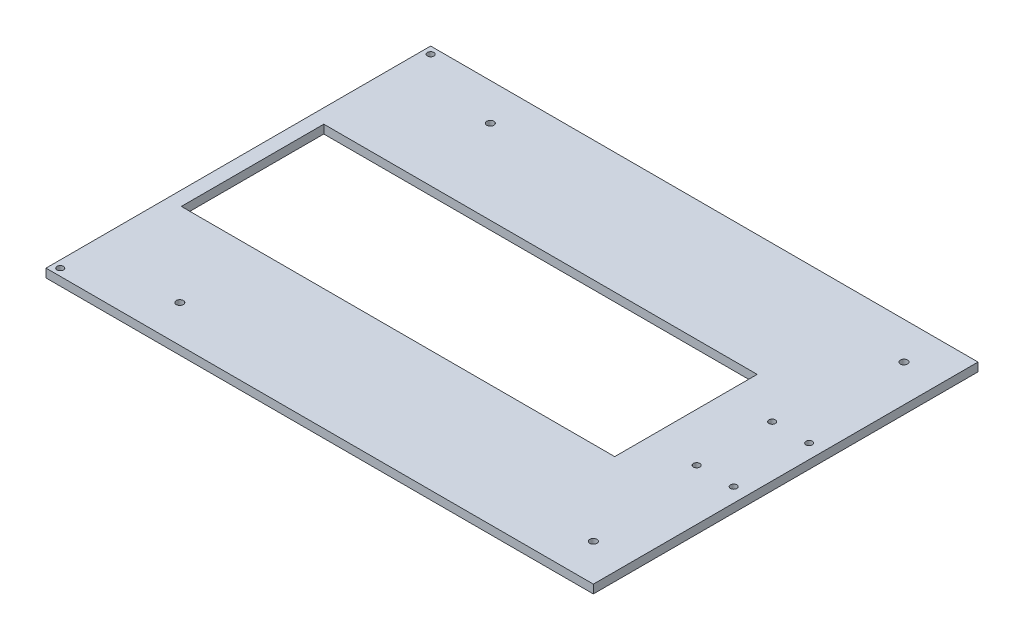
ISO-10303-21;
HEADER;
FILE_DESCRIPTION(('STEP AP214'),'2;1');
FILE_NAME('part.step','',(''),(''),'','','');
FILE_SCHEMA(('AUTOMOTIVE_DESIGN { 1 0 10303 214 1 1 1 1 }'));
ENDSEC;
DATA;
#1=APPLICATION_CONTEXT('core data for automotive mechanical design processes');
#2=APPLICATION_PROTOCOL_DEFINITION('international standard','automotive_design',2000,#1);
#3=PRODUCT_CONTEXT('',#1,'mechanical');
#4=PRODUCT('Part','Part','',(#3));
#5=PRODUCT_RELATED_PRODUCT_CATEGORY('part','',(#4));
#6=PRODUCT_DEFINITION_FORMATION('','',#4);
#7=PRODUCT_DEFINITION_CONTEXT('part definition',#1,'design');
#8=PRODUCT_DEFINITION('design','',#6,#7);
#9=PRODUCT_DEFINITION_SHAPE('','',#8);
#10=(LENGTH_UNIT() NAMED_UNIT(*) SI_UNIT(.MILLI.,.METRE.));
#11=(NAMED_UNIT(*) PLANE_ANGLE_UNIT() SI_UNIT($,.RADIAN.));
#12=(NAMED_UNIT(*) SI_UNIT($,.STERADIAN.) SOLID_ANGLE_UNIT());
#13=UNCERTAINTY_MEASURE_WITH_UNIT(LENGTH_MEASURE(1.E-05),#10,'distance_accuracy_value','');
#14=(GEOMETRIC_REPRESENTATION_CONTEXT(3) GLOBAL_UNCERTAINTY_ASSIGNED_CONTEXT((#13)) GLOBAL_UNIT_ASSIGNED_CONTEXT((#10,
#11,#12)) REPRESENTATION_CONTEXT('',''));
#15=CARTESIAN_POINT('',(0.,0.,0.));
#16=DIRECTION('',(0.,0.,1.));
#17=DIRECTION('',(1.,0.,0.));
#18=AXIS2_PLACEMENT_3D('',#15,#16,#17);
#19=CARTESIAN_POINT('',(-334.2,-12.,262.921508101416));
#20=DIRECTION('',(0.,0.,1.));
#21=DIRECTION('',(1.,0.,0.));
#22=AXIS2_PLACEMENT_3D('',#19,#20,#21);
#23=PLANE('',#22);
#24=DIRECTION('',(0.,-1.,0.));
#25=VECTOR('',#24,1.);
#26=CARTESIAN_POINT('',(-20.0000000000002,-12.,262.921508101416));
#27=LINE('',#26,#25);
#28=CARTESIAN_POINT('',(-20.0000000000002,-6.,262.921508101416));
#29=VERTEX_POINT('',#28);
#30=CARTESIAN_POINT('',(-20.0000000000002,-12.,262.921508101416));
#31=VERTEX_POINT('',#30);
#32=EDGE_CURVE('E60',#29,#31,#27,.T.);
#33=ORIENTED_EDGE('',*,*,#32,.T.);
#34=DIRECTION('',(1.,0.,0.));
#35=VECTOR('',#34,1.);
#36=CARTESIAN_POINT('',(-334.2,-12.,262.921508101416));
#37=LINE('',#36,#35);
#38=CARTESIAN_POINT('',(-324.2,-12.,262.921508101416));
#39=VERTEX_POINT('',#38);
#40=EDGE_CURVE('E214',#39,#31,#37,.T.);
#41=ORIENTED_EDGE('',*,*,#40,.F.);
#42=DIRECTION('',(0.,1.,0.));
#43=VECTOR('',#42,1.);
#44=CARTESIAN_POINT('',(-324.2,-12.,262.921508101416));
#45=LINE('',#44,#43);
#46=CARTESIAN_POINT('',(-324.2,-6.,262.921508101416));
#47=VERTEX_POINT('',#46);
#48=EDGE_CURVE('E137',#39,#47,#45,.T.);
#49=ORIENTED_EDGE('',*,*,#48,.T.);
#50=DIRECTION('',(1.,0.,0.));
#51=VECTOR('',#50,1.);
#52=CARTESIAN_POINT('',(-334.2,-6.,262.921508101416));
#53=LINE('',#52,#51);
#54=EDGE_CURVE('E221',#47,#29,#53,.T.);
#55=ORIENTED_EDGE('',*,*,#54,.T.);
#56=EDGE_LOOP('',(#33,#41,#49,#55));
#57=FACE_BOUND('',#56,.T.);
#58=ADVANCED_FACE('F43',(#57),#23,.F.);
#59=CARTESIAN_POINT('',(-2.22044604925031E-13,-12.,162.921508101416));
#60=DIRECTION('',(0.,0.,-1.));
#61=DIRECTION('',(-1.,0.,0.));
#62=AXIS2_PLACEMENT_3D('',#59,#60,#61);
#63=PLANE('',#62);
#64=DIRECTION('',(0.,1.,0.));
#65=VECTOR('',#64,1.);
#66=CARTESIAN_POINT('',(-20.0000000000002,-12.,162.921508101416));
#67=LINE('',#66,#65);
#68=CARTESIAN_POINT('',(-20.0000000000002,-12.,162.921508101416));
#69=VERTEX_POINT('',#68);
#70=CARTESIAN_POINT('',(-20.0000000000002,-6.,162.921508101416));
#71=VERTEX_POINT('',#70);
#72=EDGE_CURVE('E122',#69,#71,#67,.T.);
#73=ORIENTED_EDGE('',*,*,#72,.T.);
#74=DIRECTION('',(-1.,0.,0.));
#75=VECTOR('',#74,1.);
#76=CARTESIAN_POINT('',(-2.22044604925031E-13,-6.,162.921508101416));
#77=LINE('',#76,#75);
#78=CARTESIAN_POINT('',(-324.2,-6.,162.921508101416));
#79=VERTEX_POINT('',#78);
#80=EDGE_CURVE('E111',#71,#79,#77,.T.);
#81=ORIENTED_EDGE('',*,*,#80,.T.);
#82=DIRECTION('',(0.,1.,0.));
#83=VECTOR('',#82,1.);
#84=CARTESIAN_POINT('',(-324.2,-12.,162.921508101416));
#85=LINE('',#84,#83);
#86=CARTESIAN_POINT('',(-324.2,-12.,162.921508101416));
#87=VERTEX_POINT('',#86);
#88=EDGE_CURVE('E139',#87,#79,#85,.T.);
#89=ORIENTED_EDGE('',*,*,#88,.F.);
#90=DIRECTION('',(-1.,0.,0.));
#91=VECTOR('',#90,1.);
#92=CARTESIAN_POINT('',(-2.22044604925031E-13,-12.,162.921508101416));
#93=LINE('',#92,#91);
#94=EDGE_CURVE('E68',#69,#87,#93,.T.);
#95=ORIENTED_EDGE('',*,*,#94,.F.);
#96=EDGE_LOOP('',(#73,#81,#89,#95));
#97=FACE_BOUND('',#96,.T.);
#98=ADVANCED_FACE('F123',(#97),#63,.F.);
#99=CARTESIAN_POINT('',(49.9999999999999,6.,77.9215081014159));
#100=DIRECTION('',(-1.,0.,0.));
#101=DIRECTION('',(0.,0.,1.));
#102=AXIS2_PLACEMENT_3D('',#99,#100,#101);
#103=PLANE('',#102);
#104=DIRECTION('',(0.,0.,-1.));
#105=VECTOR('',#104,1.);
#106=CARTESIAN_POINT('',(49.9999999999999,-6.,77.9215081014159));
#107=LINE('',#106,#105);
#108=CARTESIAN_POINT('',(50.,-6.,347.9215081));
#109=VERTEX_POINT('',#108);
#110=CARTESIAN_POINT('',(50.,-6.,77.9215081));
#111=VERTEX_POINT('',#110);
#112=EDGE_CURVE('E47',#109,#111,#107,.T.);
#113=ORIENTED_EDGE('',*,*,#112,.F.);
#114=DIRECTION('',(0.,1.,0.));
#115=VECTOR('',#114,1.);
#116=CARTESIAN_POINT('',(50.,-12.,347.9215081));
#117=LINE('',#116,#115);
#118=CARTESIAN_POINT('',(50.,-12.,347.9215081));
#119=VERTEX_POINT('',#118);
#120=EDGE_CURVE('E141',#119,#109,#117,.T.);
#121=ORIENTED_EDGE('',*,*,#120,.F.);
#122=DIRECTION('',(0.,0.,1.));
#123=VECTOR('',#122,1.);
#124=CARTESIAN_POINT('',(49.9999999999999,-12.,109.921508101416));
#125=LINE('',#124,#123);
#126=CARTESIAN_POINT('',(50.,-12.,77.9215081));
#127=VERTEX_POINT('',#126);
#128=EDGE_CURVE('E219',#127,#119,#125,.T.);
#129=ORIENTED_EDGE('',*,*,#128,.F.);
#130=DIRECTION('',(0.,1.,0.));
#131=VECTOR('',#130,1.);
#132=CARTESIAN_POINT('',(50.,-12.,77.9215081));
#133=LINE('',#132,#131);
#134=EDGE_CURVE('E167',#127,#111,#133,.T.);
#135=ORIENTED_EDGE('',*,*,#134,.T.);
#136=EDGE_LOOP('',(#113,#121,#129,#135));
#137=FACE_BOUND('',#136,.T.);
#138=ADVANCED_FACE('F238',(#137),#103,.F.);
#139=CARTESIAN_POINT('',(-334.2,6.,297.921508101416));
#140=DIRECTION('',(1.,0.,0.));
#141=DIRECTION('',(0.,0.,-1.));
#142=AXIS2_PLACEMENT_3D('',#139,#140,#141);
#143=PLANE('',#142);
#144=DIRECTION('',(0.,0.,-1.));
#145=VECTOR('',#144,1.);
#146=CARTESIAN_POINT('',(-334.2,-12.,162.921508101416));
#147=LINE('',#146,#145);
#148=CARTESIAN_POINT('',(-334.2,-12.,347.9215081));
#149=VERTEX_POINT('',#148);
#150=CARTESIAN_POINT('',(-334.2,-12.,77.9215081));
#151=VERTEX_POINT('',#150);
#152=EDGE_CURVE('E217',#149,#151,#147,.T.);
#153=ORIENTED_EDGE('',*,*,#152,.F.);
#154=DIRECTION('',(0.,1.,0.));
#155=VECTOR('',#154,1.);
#156=CARTESIAN_POINT('',(-334.2,-12.,347.9215081));
#157=LINE('',#156,#155);
#158=CARTESIAN_POINT('',(-334.2,-6.,347.9215081));
#159=VERTEX_POINT('',#158);
#160=EDGE_CURVE('E176',#149,#159,#157,.T.);
#161=ORIENTED_EDGE('',*,*,#160,.T.);
#162=DIRECTION('',(0.,0.,-1.));
#163=VECTOR('',#162,1.);
#164=CARTESIAN_POINT('',(-334.2,-6.,162.921508101416));
#165=LINE('',#164,#163);
#166=CARTESIAN_POINT('',(-334.2,-6.,77.9215081));
#167=VERTEX_POINT('',#166);
#168=EDGE_CURVE('E119',#159,#167,#165,.T.);
#169=ORIENTED_EDGE('',*,*,#168,.T.);
#170=DIRECTION('',(0.,1.,0.));
#171=VECTOR('',#170,1.);
#172=CARTESIAN_POINT('',(-334.2,-12.,77.9215081));
#173=LINE('',#172,#171);
#174=EDGE_CURVE('E170',#151,#167,#173,.T.);
#175=ORIENTED_EDGE('',*,*,#174,.F.);
#176=EDGE_LOOP('',(#153,#161,#169,#175));
#177=FACE_BOUND('',#176,.T.);
#178=ADVANCED_FACE('F45',(#177),#143,.F.);
#179=CARTESIAN_POINT('',(0.,-12.,0.));
#180=DIRECTION('',(0.,1.,0.));
#181=DIRECTION('',(0.,0.,1.));
#182=AXIS2_PLACEMENT_3D('',#179,#180,#181);
#183=PLANE('',#182);
#184=DIRECTION('',(1.,0.,0.));
#185=VECTOR('',#184,1.);
#186=CARTESIAN_POINT('',(-334.2,-12.,347.9215081));
#187=LINE('',#186,#185);
#188=EDGE_CURVE('E179',#149,#119,#187,.T.);
#189=ORIENTED_EDGE('',*,*,#188,.F.);
#190=ORIENTED_EDGE('',*,*,#152,.T.);
#191=DIRECTION('',(-1.,0.,0.));
#192=VECTOR('',#191,1.);
#193=CARTESIAN_POINT('',(50.,-12.,77.9215081));
#194=LINE('',#193,#192);
#195=EDGE_CURVE('E164',#127,#151,#194,.T.);
#196=ORIENTED_EDGE('',*,*,#195,.F.);
#197=ORIENTED_EDGE('',*,*,#128,.T.);
#198=EDGE_LOOP('',(#189,#190,#196,#197));
#199=FACE_BOUND('',#198,.T.);
#200=CARTESIAN_POINT('',(13.9999999999999,-12.,239.421508101416));
#201=DIRECTION('',(0.,-1.,0.));
#202=DIRECTION('',(0.,0.,-1.));
#203=AXIS2_PLACEMENT_3D('',#200,#201,#202);
#204=CIRCLE('',#203,2.25);
#205=CARTESIAN_POINT('',(13.9999999999999,-12.,237.171508101416));
#206=VERTEX_POINT('',#205);
#207=EDGE_CURVE('E173',#206,#206,#204,.T.);
#208=ORIENTED_EDGE('',*,*,#207,.F.);
#209=EDGE_LOOP('',(#208));
#210=FACE_BOUND('',#209,.T.);
#211=CARTESIAN_POINT('',(13.9999999999999,-12.,186.421508101416));
#212=DIRECTION('',(0.,-1.,0.));
#213=DIRECTION('',(0.,0.,-1.));
#214=AXIS2_PLACEMENT_3D('',#211,#212,#213);
#215=CIRCLE('',#214,2.25);
#216=CARTESIAN_POINT('',(13.9999999999999,-12.,184.171508101416));
#217=VERTEX_POINT('',#216);
#218=EDGE_CURVE('E207',#217,#217,#215,.T.);
#219=ORIENTED_EDGE('',*,*,#218,.F.);
#220=EDGE_LOOP('',(#219));
#221=FACE_BOUND('',#220,.T.);
#222=CARTESIAN_POINT('',(39.9999999999999,-12.,186.421508101416));
#223=DIRECTION('',(0.,-1.,0.));
#224=DIRECTION('',(0.,0.,-1.));
#225=AXIS2_PLACEMENT_3D('',#222,#223,#224);
#226=CIRCLE('',#225,2.25);
#227=CARTESIAN_POINT('',(39.9999999999999,-12.,184.171508101416));
#228=VERTEX_POINT('',#227);
#229=EDGE_CURVE('E204',#228,#228,#226,.T.);
#230=ORIENTED_EDGE('',*,*,#229,.F.);
#231=EDGE_LOOP('',(#230));
#232=FACE_BOUND('',#231,.T.);
#233=CARTESIAN_POINT('',(39.9999999999999,-12.,239.421508101416));
#234=DIRECTION('',(0.,-1.,0.));
#235=DIRECTION('',(0.,0.,-1.));
#236=AXIS2_PLACEMENT_3D('',#233,#234,#235);
#237=CIRCLE('',#236,2.25);
#238=CARTESIAN_POINT('',(39.9999999999999,-12.,237.171508101416));
#239=VERTEX_POINT('',#238);
#240=EDGE_CURVE('E120',#239,#239,#237,.T.);
#241=ORIENTED_EDGE('',*,*,#240,.F.);
#242=EDGE_LOOP('',(#241));
#243=FACE_BOUND('',#242,.T.);
#244=ORIENTED_EDGE('',*,*,#40,.T.);
#245=DIRECTION('',(0.,0.,-1.));
#246=VECTOR('',#245,1.);
#247=CARTESIAN_POINT('',(-20.0000000000002,-12.,162.921508101416));
#248=LINE('',#247,#246);
#249=EDGE_CURVE('E127',#31,#69,#248,.T.);
#250=ORIENTED_EDGE('',*,*,#249,.T.);
#251=ORIENTED_EDGE('',*,*,#94,.T.);
#252=DIRECTION('',(0.,0.,-1.));
#253=VECTOR('',#252,1.);
#254=CARTESIAN_POINT('',(-324.2,-12.,162.921508101416));
#255=LINE('',#254,#253);
#256=EDGE_CURVE('E134',#39,#87,#255,.T.);
#257=ORIENTED_EDGE('',*,*,#256,.F.);
#258=EDGE_LOOP('',(#244,#250,#251,#257));
#259=FACE_BOUND('',#258,.T.);
#260=CARTESIAN_POINT('',(-266.3,-12.,103.9215081));
#261=DIRECTION('',(0.,1.,0.));
#262=DIRECTION('',(0.,0.,1.));
#263=AXIS2_PLACEMENT_3D('',#260,#261,#262);
#264=CIRCLE('',#263,2.49999999958583);
#265=CARTESIAN_POINT('',(-266.3,-12.,106.421508099586));
#266=VERTEX_POINT('',#265);
#267=EDGE_CURVE('E144',#266,#266,#264,.T.);
#268=ORIENTED_EDGE('',*,*,#267,.T.);
#269=EDGE_LOOP('',(#268));
#270=FACE_BOUND('',#269,.T.);
#271=CARTESIAN_POINT('',(-329.2,-12.,82.9215081014159));
#272=DIRECTION('',(0.,1.,0.));
#273=DIRECTION('',(0.,0.,1.));
#274=AXIS2_PLACEMENT_3D('',#271,#272,#273);
#275=CIRCLE('',#274,2.25000000000001);
#276=CARTESIAN_POINT('',(-329.2,-12.,85.1715081014159));
#277=VERTEX_POINT('',#276);
#278=EDGE_CURVE('E152',#277,#277,#275,.T.);
#279=ORIENTED_EDGE('',*,*,#278,.T.);
#280=EDGE_LOOP('',(#279));
#281=FACE_BOUND('',#280,.T.);
#282=CARTESIAN_POINT('',(24.0000000000001,-12.,103.9215081));
#283=DIRECTION('',(0.,1.,0.));
#284=DIRECTION('',(0.,0.,1.));
#285=AXIS2_PLACEMENT_3D('',#282,#283,#284);
#286=CIRCLE('',#285,2.49999999958571);
#287=CARTESIAN_POINT('',(24.0000000000001,-12.,106.421508099586));
#288=VERTEX_POINT('',#287);
#289=EDGE_CURVE('E158',#288,#288,#286,.T.);
#290=ORIENTED_EDGE('',*,*,#289,.T.);
#291=EDGE_LOOP('',(#290));
#292=FACE_BOUND('',#291,.T.);
#293=CARTESIAN_POINT('',(24.0000000000001,-12.,321.9215081));
#294=DIRECTION('',(0.,1.,0.));
#295=DIRECTION('',(0.,0.,1.));
#296=AXIS2_PLACEMENT_3D('',#293,#294,#295);
#297=CIRCLE('',#296,2.49999999999988);
#298=CARTESIAN_POINT('',(24.0000000000001,-12.,324.4215081));
#299=VERTEX_POINT('',#298);
#300=EDGE_CURVE('E197',#299,#299,#297,.T.);
#301=ORIENTED_EDGE('',*,*,#300,.T.);
#302=EDGE_LOOP('',(#301));
#303=FACE_BOUND('',#302,.T.);
#304=CARTESIAN_POINT('',(-266.3,-12.,321.9215081));
#305=DIRECTION('',(0.,1.,0.));
#306=DIRECTION('',(0.,0.,1.));
#307=AXIS2_PLACEMENT_3D('',#304,#305,#306);
#308=CIRCLE('',#307,2.4999999999999);
#309=CARTESIAN_POINT('',(-266.3,-12.,324.4215081));
#310=VERTEX_POINT('',#309);
#311=EDGE_CURVE('E191',#310,#310,#308,.T.);
#312=ORIENTED_EDGE('',*,*,#311,.T.);
#313=EDGE_LOOP('',(#312));
#314=FACE_BOUND('',#313,.T.);
#315=CARTESIAN_POINT('',(-329.2,-12.,342.921508101416));
#316=DIRECTION('',(0.,1.,0.));
#317=DIRECTION('',(0.,0.,1.));
#318=AXIS2_PLACEMENT_3D('',#315,#316,#317);
#319=CIRCLE('',#318,2.24999999999996);
#320=CARTESIAN_POINT('',(-329.2,-12.,345.171508101416));
#321=VERTEX_POINT('',#320);
#322=EDGE_CURVE('E185',#321,#321,#319,.T.);
#323=ORIENTED_EDGE('',*,*,#322,.T.);
#324=EDGE_LOOP('',(#323));
#325=FACE_BOUND('',#324,.T.);
#326=ADVANCED_FACE('F249',(#199,#210,#221,#232,#243,#259,#270,#281,#292,#303,#314,#325),#183,.F.);
#327=CARTESIAN_POINT('',(13.9999999999999,6.,239.421508101416));
#328=DIRECTION('',(0.,-1.,0.));
#329=DIRECTION('',(0.,0.,-1.));
#330=AXIS2_PLACEMENT_3D('',#327,#328,#329);
#331=CYLINDRICAL_SURFACE('',#330,2.25);
#332=ORIENTED_EDGE('',*,*,#207,.T.);
#333=EDGE_LOOP('',(#332));
#334=FACE_BOUND('',#333,.T.);
#335=CARTESIAN_POINT('',(13.9999999999999,-6.,239.421508101416));
#336=DIRECTION('',(0.,1.,0.));
#337=DIRECTION('',(0.,0.,1.));
#338=AXIS2_PLACEMENT_3D('',#335,#336,#337);
#339=CIRCLE('',#338,2.25);
#340=CARTESIAN_POINT('',(13.9999999999999,-6.,241.671508101416));
#341=VERTEX_POINT('',#340);
#342=EDGE_CURVE('E11',#341,#341,#339,.F.);
#343=ORIENTED_EDGE('',*,*,#342,.F.);
#344=EDGE_LOOP('',(#343));
#345=FACE_BOUND('',#344,.T.);
#346=ADVANCED_FACE('F252',(#334,#345),#331,.F.);
#347=CARTESIAN_POINT('',(13.9999999999999,6.,186.421508101416));
#348=DIRECTION('',(0.,-1.,0.));
#349=DIRECTION('',(0.,0.,-1.));
#350=AXIS2_PLACEMENT_3D('',#347,#348,#349);
#351=CYLINDRICAL_SURFACE('',#350,2.25);
#352=ORIENTED_EDGE('',*,*,#218,.T.);
#353=EDGE_LOOP('',(#352));
#354=FACE_BOUND('',#353,.T.);
#355=CARTESIAN_POINT('',(13.9999999999999,-6.,186.421508101416));
#356=DIRECTION('',(0.,1.,0.));
#357=DIRECTION('',(0.,0.,1.));
#358=AXIS2_PLACEMENT_3D('',#355,#356,#357);
#359=CIRCLE('',#358,2.25);
#360=CARTESIAN_POINT('',(13.9999999999999,-6.,188.671508101416));
#361=VERTEX_POINT('',#360);
#362=EDGE_CURVE('E52',#361,#361,#359,.F.);
#363=ORIENTED_EDGE('',*,*,#362,.F.);
#364=EDGE_LOOP('',(#363));
#365=FACE_BOUND('',#364,.T.);
#366=ADVANCED_FACE('F377',(#354,#365),#351,.F.);
#367=CARTESIAN_POINT('',(39.9999999999999,6.,186.421508101416));
#368=DIRECTION('',(0.,-1.,0.));
#369=DIRECTION('',(0.,0.,-1.));
#370=AXIS2_PLACEMENT_3D('',#367,#368,#369);
#371=CYLINDRICAL_SURFACE('',#370,2.25);
#372=ORIENTED_EDGE('',*,*,#229,.T.);
#373=EDGE_LOOP('',(#372));
#374=FACE_BOUND('',#373,.T.);
#375=CARTESIAN_POINT('',(39.9999999999999,-6.,186.421508101416));
#376=DIRECTION('',(0.,1.,0.));
#377=DIRECTION('',(0.,0.,1.));
#378=AXIS2_PLACEMENT_3D('',#375,#376,#377);
#379=CIRCLE('',#378,2.25);
#380=CARTESIAN_POINT('',(39.9999999999999,-6.,188.671508101416));
#381=VERTEX_POINT('',#380);
#382=EDGE_CURVE('E226',#381,#381,#379,.F.);
#383=ORIENTED_EDGE('',*,*,#382,.F.);
#384=EDGE_LOOP('',(#383));
#385=FACE_BOUND('',#384,.T.);
#386=ADVANCED_FACE('F293',(#374,#385),#371,.F.);
#387=CARTESIAN_POINT('',(39.9999999999999,6.,239.421508101416));
#388=DIRECTION('',(0.,-1.,0.));
#389=DIRECTION('',(0.,0.,-1.));
#390=AXIS2_PLACEMENT_3D('',#387,#388,#389);
#391=CYLINDRICAL_SURFACE('',#390,2.25);
#392=ORIENTED_EDGE('',*,*,#240,.T.);
#393=EDGE_LOOP('',(#392));
#394=FACE_BOUND('',#393,.T.);
#395=CARTESIAN_POINT('',(39.9999999999999,-6.,239.421508101416));
#396=DIRECTION('',(0.,1.,0.));
#397=DIRECTION('',(0.,0.,1.));
#398=AXIS2_PLACEMENT_3D('',#395,#396,#397);
#399=CIRCLE('',#398,2.25);
#400=CARTESIAN_POINT('',(39.9999999999999,-6.,241.671508101416));
#401=VERTEX_POINT('',#400);
#402=EDGE_CURVE('E228',#401,#401,#399,.F.);
#403=ORIENTED_EDGE('',*,*,#402,.F.);
#404=EDGE_LOOP('',(#403));
#405=FACE_BOUND('',#404,.T.);
#406=ADVANCED_FACE('F284',(#394,#405),#391,.F.);
#407=CARTESIAN_POINT('',(0.,-6.,0.));
#408=DIRECTION('',(0.,1.,0.));
#409=DIRECTION('',(0.,0.,1.));
#410=AXIS2_PLACEMENT_3D('',#407,#408,#409);
#411=PLANE('',#410);
#412=ORIENTED_EDGE('',*,*,#168,.F.);
#413=DIRECTION('',(1.,0.,0.));
#414=VECTOR('',#413,1.);
#415=CARTESIAN_POINT('',(-334.2,-6.,347.9215081));
#416=LINE('',#415,#414);
#417=EDGE_CURVE('E182',#159,#109,#416,.T.);
#418=ORIENTED_EDGE('',*,*,#417,.T.);
#419=ORIENTED_EDGE('',*,*,#112,.T.);
#420=DIRECTION('',(-1.,0.,0.));
#421=VECTOR('',#420,1.);
#422=CARTESIAN_POINT('',(50.,-6.,77.9215081));
#423=LINE('',#422,#421);
#424=EDGE_CURVE('E161',#111,#167,#423,.T.);
#425=ORIENTED_EDGE('',*,*,#424,.T.);
#426=EDGE_LOOP('',(#412,#418,#419,#425));
#427=FACE_BOUND('',#426,.T.);
#428=DIRECTION('',(0.,0.,-1.));
#429=VECTOR('',#428,1.);
#430=CARTESIAN_POINT('',(-324.2,-6.,162.921508101416));
#431=LINE('',#430,#429);
#432=EDGE_CURVE('E117',#47,#79,#431,.T.);
#433=ORIENTED_EDGE('',*,*,#432,.T.);
#434=ORIENTED_EDGE('',*,*,#80,.F.);
#435=DIRECTION('',(0.,0.,1.));
#436=VECTOR('',#435,1.);
#437=CARTESIAN_POINT('',(-20.0000000000002,-6.,162.921508101416));
#438=LINE('',#437,#436);
#439=EDGE_CURVE('E115',#71,#29,#438,.T.);
#440=ORIENTED_EDGE('',*,*,#439,.T.);
#441=ORIENTED_EDGE('',*,*,#54,.F.);
#442=EDGE_LOOP('',(#433,#434,#440,#441));
#443=FACE_BOUND('',#442,.T.);
#444=ORIENTED_EDGE('',*,*,#382,.T.);
#445=EDGE_LOOP('',(#444));
#446=FACE_BOUND('',#445,.T.);
#447=ORIENTED_EDGE('',*,*,#342,.T.);
#448=EDGE_LOOP('',(#447));
#449=FACE_BOUND('',#448,.T.);
#450=ORIENTED_EDGE('',*,*,#362,.T.);
#451=EDGE_LOOP('',(#450));
#452=FACE_BOUND('',#451,.T.);
#453=ORIENTED_EDGE('',*,*,#402,.T.);
#454=EDGE_LOOP('',(#453));
#455=FACE_BOUND('',#454,.T.);
#456=CARTESIAN_POINT('',(-266.3,-6.,103.9215081));
#457=DIRECTION('',(0.,1.,0.));
#458=DIRECTION('',(0.,0.,1.));
#459=AXIS2_PLACEMENT_3D('',#456,#457,#458);
#460=CIRCLE('',#459,2.49999999958583);
#461=CARTESIAN_POINT('',(-266.3,-6.,106.421508099586));
#462=VERTEX_POINT('',#461);
#463=EDGE_CURVE('E148',#462,#462,#460,.T.);
#464=ORIENTED_EDGE('',*,*,#463,.F.);
#465=EDGE_LOOP('',(#464));
#466=FACE_BOUND('',#465,.T.);
#467=CARTESIAN_POINT('',(-329.2,-6.,82.9215081014159));
#468=DIRECTION('',(0.,1.,0.));
#469=DIRECTION('',(0.,0.,1.));
#470=AXIS2_PLACEMENT_3D('',#467,#468,#469);
#471=CIRCLE('',#470,2.25000000000001);
#472=CARTESIAN_POINT('',(-329.2,-6.,85.1715081014159));
#473=VERTEX_POINT('',#472);
#474=EDGE_CURVE('E147',#473,#473,#471,.T.);
#475=ORIENTED_EDGE('',*,*,#474,.F.);
#476=EDGE_LOOP('',(#475));
#477=FACE_BOUND('',#476,.T.);
#478=CARTESIAN_POINT('',(24.0000000000001,-6.,103.9215081));
#479=DIRECTION('',(0.,1.,0.));
#480=DIRECTION('',(0.,0.,1.));
#481=AXIS2_PLACEMENT_3D('',#478,#479,#480);
#482=CIRCLE('',#481,2.49999999958571);
#483=CARTESIAN_POINT('',(24.0000000000001,-6.,106.421508099586));
#484=VERTEX_POINT('',#483);
#485=EDGE_CURVE('E155',#484,#484,#482,.T.);
#486=ORIENTED_EDGE('',*,*,#485,.F.);
#487=EDGE_LOOP('',(#486));
#488=FACE_BOUND('',#487,.T.);
#489=CARTESIAN_POINT('',(24.0000000000001,-6.,321.9215081));
#490=DIRECTION('',(0.,1.,0.));
#491=DIRECTION('',(0.,0.,1.));
#492=AXIS2_PLACEMENT_3D('',#489,#490,#491);
#493=CIRCLE('',#492,2.49999999999988);
#494=CARTESIAN_POINT('',(24.0000000000001,-6.,324.4215081));
#495=VERTEX_POINT('',#494);
#496=EDGE_CURVE('E151',#495,#495,#493,.T.);
#497=ORIENTED_EDGE('',*,*,#496,.F.);
#498=EDGE_LOOP('',(#497));
#499=FACE_BOUND('',#498,.T.);
#500=CARTESIAN_POINT('',(-266.3,-6.,321.9215081));
#501=DIRECTION('',(0.,1.,0.));
#502=DIRECTION('',(0.,0.,1.));
#503=AXIS2_PLACEMENT_3D('',#500,#501,#502);
#504=CIRCLE('',#503,2.4999999999999);
#505=CARTESIAN_POINT('',(-266.3,-6.,324.4215081));
#506=VERTEX_POINT('',#505);
#507=EDGE_CURVE('E194',#506,#506,#504,.T.);
#508=ORIENTED_EDGE('',*,*,#507,.F.);
#509=EDGE_LOOP('',(#508));
#510=FACE_BOUND('',#509,.T.);
#511=CARTESIAN_POINT('',(-329.2,-6.,342.921508101416));
#512=DIRECTION('',(0.,1.,0.));
#513=DIRECTION('',(0.,0.,1.));
#514=AXIS2_PLACEMENT_3D('',#511,#512,#513);
#515=CIRCLE('',#514,2.24999999999996);
#516=CARTESIAN_POINT('',(-329.2,-6.,345.171508101416));
#517=VERTEX_POINT('',#516);
#518=EDGE_CURVE('E188',#517,#517,#515,.T.);
#519=ORIENTED_EDGE('',*,*,#518,.F.);
#520=EDGE_LOOP('',(#519));
#521=FACE_BOUND('',#520,.T.);
#522=ADVANCED_FACE('F112',(#427,#443,#446,#449,#452,#455,#466,#477,#488,#499,#510,#521),#411,.T.);
#523=CARTESIAN_POINT('',(50.,-12.,77.9215081));
#524=DIRECTION('',(0.,0.,-1.));
#525=DIRECTION('',(-1.,0.,0.));
#526=AXIS2_PLACEMENT_3D('',#523,#524,#525);
#527=PLANE('',#526);
#528=ORIENTED_EDGE('',*,*,#424,.F.);
#529=ORIENTED_EDGE('',*,*,#134,.F.);
#530=ORIENTED_EDGE('',*,*,#195,.T.);
#531=ORIENTED_EDGE('',*,*,#174,.T.);
#532=EDGE_LOOP('',(#528,#529,#530,#531));
#533=FACE_BOUND('',#532,.T.);
#534=ADVANCED_FACE('F241',(#533),#527,.T.);
#535=CARTESIAN_POINT('',(24.0000000000001,-12.,103.9215081));
#536=DIRECTION('',(0.,1.,0.));
#537=DIRECTION('',(0.,0.,1.));
#538=AXIS2_PLACEMENT_3D('',#535,#536,#537);
#539=CYLINDRICAL_SURFACE('',#538,2.49999999958571);
#540=ORIENTED_EDGE('',*,*,#289,.F.);
#541=EDGE_LOOP('',(#540));
#542=FACE_BOUND('',#541,.T.);
#543=ORIENTED_EDGE('',*,*,#485,.T.);
#544=EDGE_LOOP('',(#543));
#545=FACE_BOUND('',#544,.T.);
#546=ADVANCED_FACE('F290',(#542,#545),#539,.F.);
#547=CARTESIAN_POINT('',(-329.2,-12.,82.9215081014159));
#548=DIRECTION('',(0.,1.,0.));
#549=DIRECTION('',(0.,0.,1.));
#550=AXIS2_PLACEMENT_3D('',#547,#548,#549);
#551=CYLINDRICAL_SURFACE('',#550,2.25000000000001);
#552=ORIENTED_EDGE('',*,*,#278,.F.);
#553=EDGE_LOOP('',(#552));
#554=FACE_BOUND('',#553,.T.);
#555=ORIENTED_EDGE('',*,*,#474,.T.);
#556=EDGE_LOOP('',(#555));
#557=FACE_BOUND('',#556,.T.);
#558=ADVANCED_FACE('F361',(#554,#557),#551,.F.);
#559=CARTESIAN_POINT('',(-266.3,-12.,103.9215081));
#560=DIRECTION('',(0.,1.,0.));
#561=DIRECTION('',(0.,0.,1.));
#562=AXIS2_PLACEMENT_3D('',#559,#560,#561);
#563=CYLINDRICAL_SURFACE('',#562,2.49999999958583);
#564=ORIENTED_EDGE('',*,*,#267,.F.);
#565=EDGE_LOOP('',(#564));
#566=FACE_BOUND('',#565,.T.);
#567=ORIENTED_EDGE('',*,*,#463,.T.);
#568=EDGE_LOOP('',(#567));
#569=FACE_BOUND('',#568,.T.);
#570=ADVANCED_FACE('F358',(#566,#569),#563,.F.);
#571=CARTESIAN_POINT('',(-334.2,-12.,347.9215081));
#572=DIRECTION('',(0.,0.,1.));
#573=DIRECTION('',(1.,0.,0.));
#574=AXIS2_PLACEMENT_3D('',#571,#572,#573);
#575=PLANE('',#574);
#576=ORIENTED_EDGE('',*,*,#417,.F.);
#577=ORIENTED_EDGE('',*,*,#160,.F.);
#578=ORIENTED_EDGE('',*,*,#188,.T.);
#579=ORIENTED_EDGE('',*,*,#120,.T.);
#580=EDGE_LOOP('',(#576,#577,#578,#579));
#581=FACE_BOUND('',#580,.T.);
#582=ADVANCED_FACE('F247',(#581),#575,.T.);
#583=CARTESIAN_POINT('',(-329.2,-12.,342.921508101416));
#584=DIRECTION('',(0.,1.,0.));
#585=DIRECTION('',(0.,0.,1.));
#586=AXIS2_PLACEMENT_3D('',#583,#584,#585);
#587=CYLINDRICAL_SURFACE('',#586,2.24999999999996);
#588=ORIENTED_EDGE('',*,*,#322,.F.);
#589=EDGE_LOOP('',(#588));
#590=FACE_BOUND('',#589,.T.);
#591=ORIENTED_EDGE('',*,*,#518,.T.);
#592=EDGE_LOOP('',(#591));
#593=FACE_BOUND('',#592,.T.);
#594=ADVANCED_FACE('F276',(#590,#593),#587,.F.);
#595=CARTESIAN_POINT('',(-266.3,-12.,321.9215081));
#596=DIRECTION('',(0.,1.,0.));
#597=DIRECTION('',(0.,0.,1.));
#598=AXIS2_PLACEMENT_3D('',#595,#596,#597);
#599=CYLINDRICAL_SURFACE('',#598,2.4999999999999);
#600=ORIENTED_EDGE('',*,*,#311,.F.);
#601=EDGE_LOOP('',(#600));
#602=FACE_BOUND('',#601,.T.);
#603=ORIENTED_EDGE('',*,*,#507,.T.);
#604=EDGE_LOOP('',(#603));
#605=FACE_BOUND('',#604,.T.);
#606=ADVANCED_FACE('F279',(#602,#605),#599,.F.);
#607=CARTESIAN_POINT('',(24.0000000000001,-12.,321.9215081));
#608=DIRECTION('',(0.,1.,0.));
#609=DIRECTION('',(0.,0.,1.));
#610=AXIS2_PLACEMENT_3D('',#607,#608,#609);
#611=CYLINDRICAL_SURFACE('',#610,2.49999999999988);
#612=ORIENTED_EDGE('',*,*,#300,.F.);
#613=EDGE_LOOP('',(#612));
#614=FACE_BOUND('',#613,.T.);
#615=ORIENTED_EDGE('',*,*,#496,.T.);
#616=EDGE_LOOP('',(#615));
#617=FACE_BOUND('',#616,.T.);
#618=ADVANCED_FACE('F314',(#614,#617),#611,.F.);
#619=CARTESIAN_POINT('',(-324.2,-12.,162.921508101416));
#620=DIRECTION('',(1.,0.,0.));
#621=DIRECTION('',(0.,0.,-1.));
#622=AXIS2_PLACEMENT_3D('',#619,#620,#621);
#623=PLANE('',#622);
#624=ORIENTED_EDGE('',*,*,#432,.F.);
#625=ORIENTED_EDGE('',*,*,#48,.F.);
#626=ORIENTED_EDGE('',*,*,#256,.T.);
#627=ORIENTED_EDGE('',*,*,#88,.T.);
#628=EDGE_LOOP('',(#624,#625,#626,#627));
#629=FACE_BOUND('',#628,.T.);
#630=ADVANCED_FACE('F318',(#629),#623,.T.);
#631=CARTESIAN_POINT('',(-20.0000000000002,6.,127.921508101416));
#632=DIRECTION('',(1.,0.,0.));
#633=DIRECTION('',(0.,0.,-1.));
#634=AXIS2_PLACEMENT_3D('',#631,#632,#633);
#635=PLANE('',#634);
#636=ORIENTED_EDGE('',*,*,#249,.F.);
#637=ORIENTED_EDGE('',*,*,#32,.F.);
#638=ORIENTED_EDGE('',*,*,#439,.F.);
#639=ORIENTED_EDGE('',*,*,#72,.F.);
#640=EDGE_LOOP('',(#636,#637,#638,#639));
#641=FACE_BOUND('',#640,.T.);
#642=ADVANCED_FACE('F129',(#641),#635,.F.);
#643=CLOSED_SHELL('',(#58,#98,#138,#178,#326,#346,#366,#386,#406,#522,#534,#546,#558,#570,#582,
#594,#606,#618,#630,#642));
#644=MANIFOLD_SOLID_BREP('B2',#643);
#645=ADVANCED_BREP_SHAPE_REPRESENTATION('',(#18,#644),#14);
#646=SHAPE_DEFINITION_REPRESENTATION(#9,#645);
ENDSEC;
END-ISO-10303-21;
